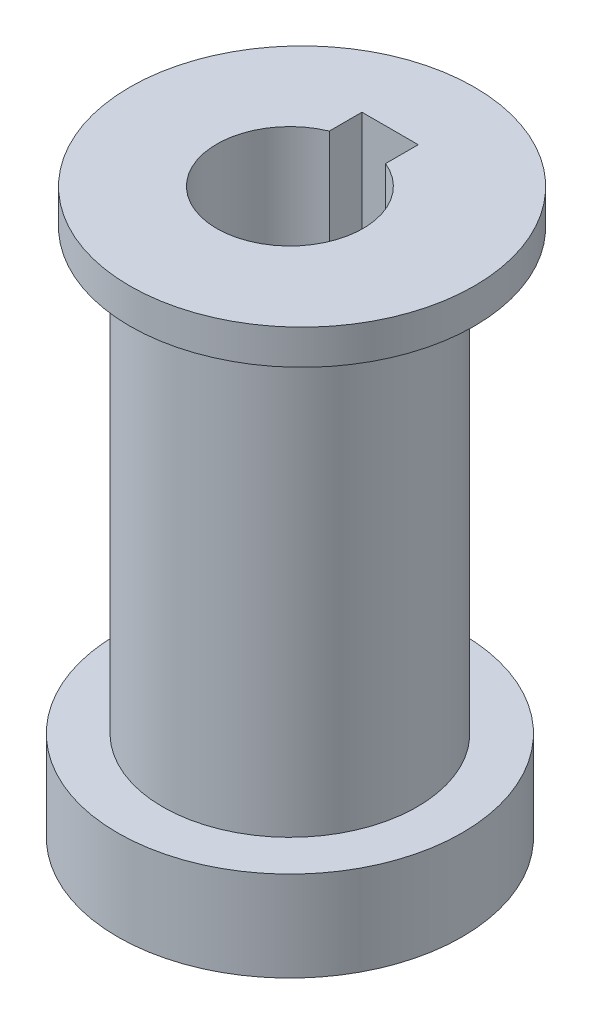
ISO-10303-21;
HEADER;
FILE_DESCRIPTION(('STEP AP214'),'2;1');
FILE_NAME('part.step','',(''),(''),'','','');
FILE_SCHEMA(('AUTOMOTIVE_DESIGN { 1 0 10303 214 1 1 1 1 }'));
ENDSEC;
DATA;
#1=APPLICATION_CONTEXT('core data for automotive mechanical design processes');
#2=APPLICATION_PROTOCOL_DEFINITION('international standard','automotive_design',2000,#1);
#3=PRODUCT_CONTEXT('',#1,'mechanical');
#4=PRODUCT('Part','Part','',(#3));
#5=PRODUCT_RELATED_PRODUCT_CATEGORY('part','',(#4));
#6=PRODUCT_DEFINITION_FORMATION('','',#4);
#7=PRODUCT_DEFINITION_CONTEXT('part definition',#1,'design');
#8=PRODUCT_DEFINITION('design','',#6,#7);
#9=PRODUCT_DEFINITION_SHAPE('','',#8);
#10=(LENGTH_UNIT() NAMED_UNIT(*) SI_UNIT(.MILLI.,.METRE.));
#11=(NAMED_UNIT(*) PLANE_ANGLE_UNIT() SI_UNIT($,.RADIAN.));
#12=(NAMED_UNIT(*) SI_UNIT($,.STERADIAN.) SOLID_ANGLE_UNIT());
#13=UNCERTAINTY_MEASURE_WITH_UNIT(LENGTH_MEASURE(1.E-05),#10,'distance_accuracy_value','');
#14=(GEOMETRIC_REPRESENTATION_CONTEXT(3) GLOBAL_UNCERTAINTY_ASSIGNED_CONTEXT((#13)) GLOBAL_UNIT_ASSIGNED_CONTEXT((#10,
#11,#12)) REPRESENTATION_CONTEXT('',''));
#15=CARTESIAN_POINT('',(0.,0.,0.));
#16=DIRECTION('',(0.,0.,1.));
#17=DIRECTION('',(1.,0.,0.));
#18=AXIS2_PLACEMENT_3D('',#15,#16,#17);
#19=CARTESIAN_POINT('',(0.,8.,0.));
#20=DIRECTION('',(0.,-1.,0.));
#21=DIRECTION('',(0.,0.,-1.));
#22=AXIS2_PLACEMENT_3D('',#19,#20,#21);
#23=CYLINDRICAL_SURFACE('',#22,15.3);
#24=CARTESIAN_POINT('',(0.,8.,0.));
#25=DIRECTION('',(0.,1.,0.));
#26=DIRECTION('',(0.,0.,1.));
#27=AXIS2_PLACEMENT_3D('',#24,#25,#26);
#28=CIRCLE('',#27,15.3);
#29=CARTESIAN_POINT('',(0.,8.,15.3));
#30=VERTEX_POINT('',#29);
#31=EDGE_CURVE('E47',#30,#30,#28,.T.);
#32=ORIENTED_EDGE('',*,*,#31,.F.);
#33=EDGE_LOOP('',(#32));
#34=FACE_BOUND('',#33,.T.);
#35=CARTESIAN_POINT('',(0.,0.,0.));
#36=DIRECTION('',(0.,1.,0.));
#37=DIRECTION('',(0.,0.,1.));
#38=AXIS2_PLACEMENT_3D('',#35,#36,#37);
#39=CIRCLE('',#38,15.3);
#40=CARTESIAN_POINT('',(0.,0.,15.3));
#41=VERTEX_POINT('',#40);
#42=EDGE_CURVE('E42',#41,#41,#39,.T.);
#43=ORIENTED_EDGE('',*,*,#42,.T.);
#44=EDGE_LOOP('',(#43));
#45=FACE_BOUND('',#44,.T.);
#46=ADVANCED_FACE('F39',(#34,#45),#23,.T.);
#47=CARTESIAN_POINT('',(0.,8.,0.));
#48=DIRECTION('',(0.,1.,0.));
#49=DIRECTION('',(0.,0.,1.));
#50=AXIS2_PLACEMENT_3D('',#47,#48,#49);
#51=PLANE('',#50);
#52=CARTESIAN_POINT('',(0.,8.,0.));
#53=DIRECTION('',(0.,1.,0.));
#54=DIRECTION('',(0.,0.,1.));
#55=AXIS2_PLACEMENT_3D('',#52,#53,#54);
#56=CIRCLE('',#55,11.3);
#57=CARTESIAN_POINT('',(0.,8.,11.3));
#58=VERTEX_POINT('',#57);
#59=EDGE_CURVE('E11',#58,#58,#56,.T.);
#60=ORIENTED_EDGE('',*,*,#59,.F.);
#61=EDGE_LOOP('',(#60));
#62=FACE_BOUND('',#61,.T.);
#63=ORIENTED_EDGE('',*,*,#31,.T.);
#64=EDGE_LOOP('',(#63));
#65=FACE_BOUND('',#64,.T.);
#66=ADVANCED_FACE('F136',(#62,#65),#51,.T.);
#67=CARTESIAN_POINT('',(0.,0.,0.));
#68=DIRECTION('',(0.,1.,0.));
#69=DIRECTION('',(0.,0.,1.));
#70=AXIS2_PLACEMENT_3D('',#67,#68,#69);
#71=PLANE('',#70);
#72=CARTESIAN_POINT('',(0.,0.,0.));
#73=DIRECTION('',(0.,1.,0.));
#74=DIRECTION('',(0.,0.,1.));
#75=AXIS2_PLACEMENT_3D('',#72,#73,#74);
#76=CIRCLE('',#75,6.5);
#77=CARTESIAN_POINT('',(-2.5,0.,-6.));
#78=VERTEX_POINT('',#77);
#79=CARTESIAN_POINT('',(2.5,0.,-6.));
#80=VERTEX_POINT('',#79);
#81=EDGE_CURVE('E112',#78,#80,#76,.T.);
#82=ORIENTED_EDGE('',*,*,#81,.T.);
#83=DIRECTION('',(0.,0.,-1.));
#84=VECTOR('',#83,1.);
#85=CARTESIAN_POINT('',(2.5,0.,0.));
#86=LINE('',#85,#84);
#87=CARTESIAN_POINT('',(2.5,0.,-8.9));
#88=VERTEX_POINT('',#87);
#89=EDGE_CURVE('E115',#80,#88,#86,.T.);
#90=ORIENTED_EDGE('',*,*,#89,.T.);
#91=DIRECTION('',(-1.,0.,0.));
#92=VECTOR('',#91,1.);
#93=CARTESIAN_POINT('',(0.,0.,-8.9));
#94=LINE('',#93,#92);
#95=CARTESIAN_POINT('',(-2.5,0.,-8.9));
#96=VERTEX_POINT('',#95);
#97=EDGE_CURVE('E107',#88,#96,#94,.T.);
#98=ORIENTED_EDGE('',*,*,#97,.T.);
#99=DIRECTION('',(0.,0.,1.));
#100=VECTOR('',#99,1.);
#101=CARTESIAN_POINT('',(-2.5,0.,0.));
#102=LINE('',#101,#100);
#103=EDGE_CURVE('E87',#96,#78,#102,.T.);
#104=ORIENTED_EDGE('',*,*,#103,.T.);
#105=EDGE_LOOP('',(#82,#90,#98,#104));
#106=FACE_BOUND('',#105,.T.);
#107=ORIENTED_EDGE('',*,*,#42,.F.);
#108=EDGE_LOOP('',(#107));
#109=FACE_BOUND('',#108,.T.);
#110=ADVANCED_FACE('F133',(#106,#109),#71,.F.);
#111=CARTESIAN_POINT('',(0.,47.,0.));
#112=DIRECTION('',(0.,-1.,0.));
#113=DIRECTION('',(0.,0.,-1.));
#114=AXIS2_PLACEMENT_3D('',#111,#112,#113);
#115=CYLINDRICAL_SURFACE('',#114,11.3);
#116=CARTESIAN_POINT('',(0.,47.,0.));
#117=DIRECTION('',(0.,1.,0.));
#118=DIRECTION('',(0.,0.,1.));
#119=AXIS2_PLACEMENT_3D('',#116,#117,#118);
#120=CIRCLE('',#119,11.3);
#121=CARTESIAN_POINT('',(0.,47.,11.3));
#122=VERTEX_POINT('',#121);
#123=EDGE_CURVE('E122',#122,#122,#120,.T.);
#124=ORIENTED_EDGE('',*,*,#123,.F.);
#125=EDGE_LOOP('',(#124));
#126=FACE_BOUND('',#125,.T.);
#127=ORIENTED_EDGE('',*,*,#59,.T.);
#128=EDGE_LOOP('',(#127));
#129=FACE_BOUND('',#128,.T.);
#130=ADVANCED_FACE('F135',(#126,#129),#115,.T.);
#131=CARTESIAN_POINT('',(0.559173947577436,50.0886517124329,-0.524225575853992));
#132=DIRECTION('',(0.,-1.,0.));
#133=DIRECTION('',(0.,0.,-1.));
#134=AXIS2_PLACEMENT_3D('',#131,#132,#133);
#135=CYLINDRICAL_SURFACE('',#134,15.3);
#136=CARTESIAN_POINT('',(0.559173947577436,50.0886517124329,-0.524225575853992));
#137=DIRECTION('',(0.,1.,0.));
#138=DIRECTION('',(0.,0.,1.));
#139=AXIS2_PLACEMENT_3D('',#136,#137,#138);
#140=CIRCLE('',#139,15.3);
#141=CARTESIAN_POINT('',(0.559173947577436,50.0886517124329,14.775774424146));
#142=VERTEX_POINT('',#141);
#143=EDGE_CURVE('E119',#142,#142,#140,.T.);
#144=ORIENTED_EDGE('',*,*,#143,.F.);
#145=EDGE_LOOP('',(#144));
#146=FACE_BOUND('',#145,.T.);
#147=CARTESIAN_POINT('',(0.559173947577436,47.,-0.524225575853992));
#148=DIRECTION('',(0.,1.,0.));
#149=DIRECTION('',(0.,0.,1.));
#150=AXIS2_PLACEMENT_3D('',#147,#148,#149);
#151=CIRCLE('',#150,15.3);
#152=CARTESIAN_POINT('',(0.559173947577436,47.,14.775774424146));
#153=VERTEX_POINT('',#152);
#154=EDGE_CURVE('E118',#153,#153,#151,.T.);
#155=ORIENTED_EDGE('',*,*,#154,.T.);
#156=EDGE_LOOP('',(#155));
#157=FACE_BOUND('',#156,.T.);
#158=ADVANCED_FACE('F142',(#146,#157),#135,.T.);
#159=CARTESIAN_POINT('',(0.559173947577436,50.0886517124329,-0.524225575853992));
#160=DIRECTION('',(0.,1.,0.));
#161=DIRECTION('',(0.,0.,1.));
#162=AXIS2_PLACEMENT_3D('',#159,#160,#161);
#163=PLANE('',#162);
#164=DIRECTION('',(0.,0.,-1.));
#165=VECTOR('',#164,1.);
#166=CARTESIAN_POINT('',(2.5,50.0886517124329,-8.9));
#167=LINE('',#166,#165);
#168=CARTESIAN_POINT('',(2.5,50.0886517124329,-6.));
#169=VERTEX_POINT('',#168);
#170=CARTESIAN_POINT('',(2.5,50.0886517124329,-8.9));
#171=VERTEX_POINT('',#170);
#172=EDGE_CURVE('E63',#169,#171,#167,.T.);
#173=ORIENTED_EDGE('',*,*,#172,.F.);
#174=CARTESIAN_POINT('',(0.,50.0886517124329,0.));
#175=DIRECTION('',(0.,1.,0.));
#176=DIRECTION('',(0.,0.,1.));
#177=AXIS2_PLACEMENT_3D('',#174,#175,#176);
#178=CIRCLE('',#177,6.5);
#179=CARTESIAN_POINT('',(-2.5,50.0886517124329,-6.));
#180=VERTEX_POINT('',#179);
#181=EDGE_CURVE('E100',#180,#169,#178,.T.);
#182=ORIENTED_EDGE('',*,*,#181,.F.);
#183=DIRECTION('',(0.,0.,1.));
#184=VECTOR('',#183,1.);
#185=CARTESIAN_POINT('',(-2.5,50.0886517124329,-8.9));
#186=LINE('',#185,#184);
#187=CARTESIAN_POINT('',(-2.5,50.0886517124329,-8.9));
#188=VERTEX_POINT('',#187);
#189=EDGE_CURVE('E84',#188,#180,#186,.T.);
#190=ORIENTED_EDGE('',*,*,#189,.F.);
#191=DIRECTION('',(-1.,0.,0.));
#192=VECTOR('',#191,1.);
#193=CARTESIAN_POINT('',(-2.5,50.0886517124329,-8.9));
#194=LINE('',#193,#192);
#195=EDGE_CURVE('E93',#171,#188,#194,.T.);
#196=ORIENTED_EDGE('',*,*,#195,.F.);
#197=EDGE_LOOP('',(#173,#182,#190,#196));
#198=FACE_BOUND('',#197,.T.);
#199=ORIENTED_EDGE('',*,*,#143,.T.);
#200=EDGE_LOOP('',(#199));
#201=FACE_BOUND('',#200,.T.);
#202=ADVANCED_FACE('F97',(#198,#201),#163,.T.);
#203=CARTESIAN_POINT('',(0.559173947577436,47.,-0.524225575853992));
#204=DIRECTION('',(0.,1.,0.));
#205=DIRECTION('',(0.,0.,1.));
#206=AXIS2_PLACEMENT_3D('',#203,#204,#205);
#207=PLANE('',#206);
#208=ORIENTED_EDGE('',*,*,#123,.T.);
#209=EDGE_LOOP('',(#208));
#210=FACE_BOUND('',#209,.T.);
#211=ORIENTED_EDGE('',*,*,#154,.F.);
#212=EDGE_LOOP('',(#211));
#213=FACE_BOUND('',#212,.T.);
#214=ADVANCED_FACE('F181',(#210,#213),#207,.F.);
#215=CARTESIAN_POINT('',(2.5,-0.911348287567088,-8.9));
#216=DIRECTION('',(1.,0.,0.));
#217=DIRECTION('',(0.,0.,-1.));
#218=AXIS2_PLACEMENT_3D('',#215,#216,#217);
#219=PLANE('',#218);
#220=DIRECTION('',(0.,1.,0.));
#221=VECTOR('',#220,1.);
#222=CARTESIAN_POINT('',(2.5,-0.911348287567088,-6.));
#223=LINE('',#222,#221);
#224=EDGE_CURVE('E105',#80,#169,#223,.T.);
#225=ORIENTED_EDGE('',*,*,#224,.T.);
#226=ORIENTED_EDGE('',*,*,#172,.T.);
#227=DIRECTION('',(0.,1.,0.));
#228=VECTOR('',#227,1.);
#229=CARTESIAN_POINT('',(2.5,-0.911348287567088,-8.9));
#230=LINE('',#229,#228);
#231=EDGE_CURVE('E90',#88,#171,#230,.T.);
#232=ORIENTED_EDGE('',*,*,#231,.F.);
#233=ORIENTED_EDGE('',*,*,#89,.F.);
#234=EDGE_LOOP('',(#225,#226,#232,#233));
#235=FACE_BOUND('',#234,.T.);
#236=ADVANCED_FACE('F185',(#235),#219,.F.);
#237=CARTESIAN_POINT('',(0.,-0.911348287567088,0.));
#238=DIRECTION('',(0.,1.,0.));
#239=DIRECTION('',(0.,0.,1.));
#240=AXIS2_PLACEMENT_3D('',#237,#238,#239);
#241=CYLINDRICAL_SURFACE('',#240,6.5);
#242=DIRECTION('',(0.,1.,0.));
#243=VECTOR('',#242,1.);
#244=CARTESIAN_POINT('',(-2.5,-0.911348287567088,-6.));
#245=LINE('',#244,#243);
#246=EDGE_CURVE('E89',#78,#180,#245,.T.);
#247=ORIENTED_EDGE('',*,*,#246,.T.);
#248=ORIENTED_EDGE('',*,*,#181,.T.);
#249=ORIENTED_EDGE('',*,*,#224,.F.);
#250=ORIENTED_EDGE('',*,*,#81,.F.);
#251=EDGE_LOOP('',(#247,#248,#249,#250));
#252=FACE_BOUND('',#251,.T.);
#253=ADVANCED_FACE('F208',(#252),#241,.F.);
#254=CARTESIAN_POINT('',(-2.5,-0.911348287567088,-8.9));
#255=DIRECTION('',(-1.,0.,0.));
#256=DIRECTION('',(0.,0.,1.));
#257=AXIS2_PLACEMENT_3D('',#254,#255,#256);
#258=PLANE('',#257);
#259=DIRECTION('',(0.,1.,0.));
#260=VECTOR('',#259,1.);
#261=CARTESIAN_POINT('',(-2.5,-0.911348287567088,-8.9));
#262=LINE('',#261,#260);
#263=EDGE_CURVE('E55',#96,#188,#262,.T.);
#264=ORIENTED_EDGE('',*,*,#263,.T.);
#265=ORIENTED_EDGE('',*,*,#189,.T.);
#266=ORIENTED_EDGE('',*,*,#246,.F.);
#267=ORIENTED_EDGE('',*,*,#103,.F.);
#268=EDGE_LOOP('',(#264,#265,#266,#267));
#269=FACE_BOUND('',#268,.T.);
#270=ADVANCED_FACE('F81',(#269),#258,.F.);
#271=CARTESIAN_POINT('',(-2.5,-0.911348287567088,-8.9));
#272=DIRECTION('',(0.,0.,-1.));
#273=DIRECTION('',(-1.,0.,0.));
#274=AXIS2_PLACEMENT_3D('',#271,#272,#273);
#275=PLANE('',#274);
#276=ORIENTED_EDGE('',*,*,#231,.T.);
#277=ORIENTED_EDGE('',*,*,#195,.T.);
#278=ORIENTED_EDGE('',*,*,#263,.F.);
#279=ORIENTED_EDGE('',*,*,#97,.F.);
#280=EDGE_LOOP('',(#276,#277,#278,#279));
#281=FACE_BOUND('',#280,.T.);
#282=ADVANCED_FACE('F94',(#281),#275,.F.);
#283=CLOSED_SHELL('',(#46,#66,#110,#130,#158,#202,#214,#236,#253,#270,#282));
#284=MANIFOLD_SOLID_BREP('B2',#283);
#285=ADVANCED_BREP_SHAPE_REPRESENTATION('',(#18,#284),#14);
#286=SHAPE_DEFINITION_REPRESENTATION(#9,#285);
ENDSEC;
END-ISO-10303-21;
